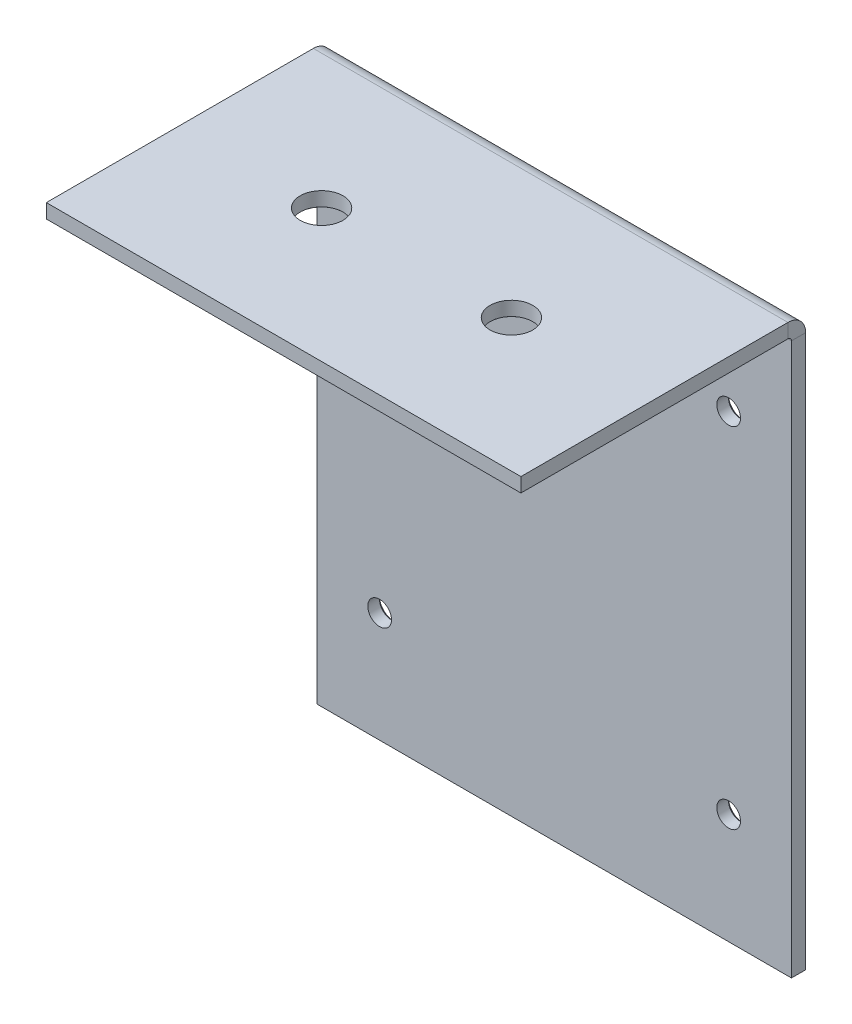
ISO-10303-21;
HEADER;
FILE_DESCRIPTION(('STEP AP214'),'2;1');
FILE_NAME('part.step','',(''),(''),'','','');
FILE_SCHEMA(('AUTOMOTIVE_DESIGN { 1 0 10303 214 1 1 1 1 }'));
ENDSEC;
DATA;
#1=APPLICATION_CONTEXT('core data for automotive mechanical design processes');
#2=APPLICATION_PROTOCOL_DEFINITION('international standard','automotive_design',2000,#1);
#3=PRODUCT_CONTEXT('',#1,'mechanical');
#4=PRODUCT('Part','Part','',(#3));
#5=PRODUCT_RELATED_PRODUCT_CATEGORY('part','',(#4));
#6=PRODUCT_DEFINITION_FORMATION('','',#4);
#7=PRODUCT_DEFINITION_CONTEXT('part definition',#1,'design');
#8=PRODUCT_DEFINITION('design','',#6,#7);
#9=PRODUCT_DEFINITION_SHAPE('','',#8);
#10=(LENGTH_UNIT() NAMED_UNIT(*) SI_UNIT(.MILLI.,.METRE.));
#11=(NAMED_UNIT(*) PLANE_ANGLE_UNIT() SI_UNIT($,.RADIAN.));
#12=(NAMED_UNIT(*) SI_UNIT($,.STERADIAN.) SOLID_ANGLE_UNIT());
#13=UNCERTAINTY_MEASURE_WITH_UNIT(LENGTH_MEASURE(1.E-05),#10,'distance_accuracy_value','');
#14=(GEOMETRIC_REPRESENTATION_CONTEXT(3) GLOBAL_UNCERTAINTY_ASSIGNED_CONTEXT((#13)) GLOBAL_UNIT_ASSIGNED_CONTEXT((#10,
#11,#12)) REPRESENTATION_CONTEXT('',''));
#15=CARTESIAN_POINT('',(0.,0.,0.));
#16=DIRECTION('',(0.,0.,1.));
#17=DIRECTION('',(1.,0.,0.));
#18=AXIS2_PLACEMENT_3D('',#15,#16,#17);
#19=CARTESIAN_POINT('',(0.,0.,-3.));
#20=DIRECTION('',(0.,0.,1.));
#21=DIRECTION('',(1.,0.,0.));
#22=AXIS2_PLACEMENT_3D('',#19,#20,#21);
#23=PLANE('',#22);
#24=CARTESIAN_POINT('',(-36.7699999999996,36.7700000000011,-3.));
#25=DIRECTION('',(0.,0.,-1.));
#26=DIRECTION('',(-1.,0.,0.));
#27=AXIS2_PLACEMENT_3D('',#24,#25,#26);
#28=CIRCLE('',#27,3.025);
#29=CARTESIAN_POINT('',(-39.7949999999996,36.7700000000011,-3.));
#30=VERTEX_POINT('',#29);
#31=EDGE_CURVE('E139',#30,#30,#28,.T.);
#32=ORIENTED_EDGE('',*,*,#31,.F.);
#33=EDGE_LOOP('',(#32));
#34=FACE_BOUND('',#33,.T.);
#35=CARTESIAN_POINT('',(-36.77,-36.7699999999993,-3.));
#36=DIRECTION('',(0.,0.,-1.));
#37=DIRECTION('',(-1.,0.,0.));
#38=AXIS2_PLACEMENT_3D('',#35,#36,#37);
#39=CIRCLE('',#38,3.025);
#40=CARTESIAN_POINT('',(-39.795,-36.7699999999993,-3.));
#41=VERTEX_POINT('',#40);
#42=EDGE_CURVE('E138',#41,#41,#39,.T.);
#43=ORIENTED_EDGE('',*,*,#42,.F.);
#44=EDGE_LOOP('',(#43));
#45=FACE_BOUND('',#44,.T.);
#46=CARTESIAN_POINT('',(36.7699999999999,-36.7699999999994,-3.));
#47=DIRECTION('',(0.,0.,-1.));
#48=DIRECTION('',(-1.,0.,0.));
#49=AXIS2_PLACEMENT_3D('',#46,#47,#48);
#50=CIRCLE('',#49,3.025);
#51=CARTESIAN_POINT('',(33.7449999999999,-36.7699999999994,-3.));
#52=VERTEX_POINT('',#51);
#53=EDGE_CURVE('E131',#52,#52,#50,.T.);
#54=ORIENTED_EDGE('',*,*,#53,.F.);
#55=EDGE_LOOP('',(#54));
#56=FACE_BOUND('',#55,.T.);
#57=DIRECTION('',(-1.,0.,0.));
#58=VECTOR('',#57,1.);
#59=CARTESIAN_POINT('',(-50.,56.2634,-3.));
#60=LINE('',#59,#58);
#61=CARTESIAN_POINT('',(-50.,56.2634,-3.));
#62=VERTEX_POINT('',#61);
#63=CARTESIAN_POINT('',(50.,56.2634,-3.));
#64=VERTEX_POINT('',#63);
#65=EDGE_CURVE('E207',#62,#64,#60,.F.);
#66=ORIENTED_EDGE('',*,*,#65,.T.);
#67=DIRECTION('',(0.,1.,0.));
#68=VECTOR('',#67,1.);
#69=CARTESIAN_POINT('',(50.,60.,-3.));
#70=LINE('',#69,#68);
#71=CARTESIAN_POINT('',(50.,-60.,-3.));
#72=VERTEX_POINT('',#71);
#73=EDGE_CURVE('E116',#72,#64,#70,.T.);
#74=ORIENTED_EDGE('',*,*,#73,.F.);
#75=DIRECTION('',(1.,0.,0.));
#76=VECTOR('',#75,1.);
#77=CARTESIAN_POINT('',(-50.,-60.,-3.));
#78=LINE('',#77,#76);
#79=CARTESIAN_POINT('',(-50.,-60.,-3.));
#80=VERTEX_POINT('',#79);
#81=EDGE_CURVE('E106',#80,#72,#78,.T.);
#82=ORIENTED_EDGE('',*,*,#81,.F.);
#83=DIRECTION('',(0.,-1.,0.));
#84=VECTOR('',#83,1.);
#85=CARTESIAN_POINT('',(-50.,60.,-3.));
#86=LINE('',#85,#84);
#87=EDGE_CURVE('E119',#62,#80,#86,.T.);
#88=ORIENTED_EDGE('',*,*,#87,.F.);
#89=EDGE_LOOP('',(#66,#74,#82,#88));
#90=FACE_BOUND('',#89,.T.);
#91=CARTESIAN_POINT('',(36.77,36.7700000000007,-3.));
#92=DIRECTION('',(0.,0.,-1.));
#93=DIRECTION('',(-1.,0.,0.));
#94=AXIS2_PLACEMENT_3D('',#91,#92,#93);
#95=CIRCLE('',#94,3.025);
#96=CARTESIAN_POINT('',(33.745,36.7700000000007,-3.));
#97=VERTEX_POINT('',#96);
#98=EDGE_CURVE('E145',#97,#97,#95,.T.);
#99=ORIENTED_EDGE('',*,*,#98,.F.);
#100=EDGE_LOOP('',(#99));
#101=FACE_BOUND('',#100,.T.);
#102=ADVANCED_FACE('F65',(#34,#45,#56,#90,#101),#23,.F.);
#103=CARTESIAN_POINT('',(-50.,60.,-3.));
#104=DIRECTION('',(-1.,0.,0.));
#105=DIRECTION('',(0.,-1.,0.));
#106=AXIS2_PLACEMENT_3D('',#103,#104,#105);
#107=PLANE('',#106);
#108=DIRECTION('',(0.,-1.,0.));
#109=VECTOR('',#108,1.);
#110=CARTESIAN_POINT('',(-50.,60.,0.));
#111=LINE('',#110,#109);
#112=CARTESIAN_POINT('',(-50.,56.2634,0.));
#113=VERTEX_POINT('',#112);
#114=CARTESIAN_POINT('',(-50.,-60.,0.));
#115=VERTEX_POINT('',#114);
#116=EDGE_CURVE('E115',#113,#115,#111,.T.);
#117=ORIENTED_EDGE('',*,*,#116,.F.);
#118=DIRECTION('',(0.,0.,-1.));
#119=VECTOR('',#118,1.);
#120=CARTESIAN_POINT('',(-50.,56.2634,0.));
#121=LINE('',#120,#119);
#122=EDGE_CURVE('E216',#113,#62,#121,.T.);
#123=ORIENTED_EDGE('',*,*,#122,.T.);
#124=ORIENTED_EDGE('',*,*,#87,.T.);
#125=DIRECTION('',(0.,0.,1.));
#126=VECTOR('',#125,1.);
#127=CARTESIAN_POINT('',(-50.,-60.,-3.));
#128=LINE('',#127,#126);
#129=EDGE_CURVE('E74',#80,#115,#128,.T.);
#130=ORIENTED_EDGE('',*,*,#129,.T.);
#131=EDGE_LOOP('',(#117,#123,#124,#130));
#132=FACE_BOUND('',#131,.T.);
#133=ADVANCED_FACE('F233',(#132),#107,.T.);
#134=CARTESIAN_POINT('',(0.,0.,0.));
#135=DIRECTION('',(0.,0.,1.));
#136=DIRECTION('',(1.,0.,0.));
#137=AXIS2_PLACEMENT_3D('',#134,#135,#136);
#138=PLANE('',#137);
#139=CARTESIAN_POINT('',(36.77,36.7700000000007,0.));
#140=DIRECTION('',(0.,0.,1.));
#141=DIRECTION('',(1.,0.,0.));
#142=AXIS2_PLACEMENT_3D('',#139,#140,#141);
#143=CIRCLE('',#142,2.49999999999999);
#144=CARTESIAN_POINT('',(39.27,36.7700000000007,0.));
#145=VERTEX_POINT('',#144);
#146=EDGE_CURVE('E136',#145,#145,#143,.T.);
#147=ORIENTED_EDGE('',*,*,#146,.F.);
#148=EDGE_LOOP('',(#147));
#149=FACE_BOUND('',#148,.T.);
#150=CARTESIAN_POINT('',(-36.7699999999996,36.7700000000011,0.));
#151=DIRECTION('',(0.,0.,1.));
#152=DIRECTION('',(1.,0.,0.));
#153=AXIS2_PLACEMENT_3D('',#150,#151,#152);
#154=CIRCLE('',#153,2.49999999999999);
#155=CARTESIAN_POINT('',(-34.2699999999996,36.7700000000011,0.));
#156=VERTEX_POINT('',#155);
#157=EDGE_CURVE('E134',#156,#156,#154,.T.);
#158=ORIENTED_EDGE('',*,*,#157,.F.);
#159=EDGE_LOOP('',(#158));
#160=FACE_BOUND('',#159,.T.);
#161=CARTESIAN_POINT('',(-36.77,-36.7699999999993,0.));
#162=DIRECTION('',(0.,0.,1.));
#163=DIRECTION('',(1.,0.,0.));
#164=AXIS2_PLACEMENT_3D('',#161,#162,#163);
#165=CIRCLE('',#164,2.49999999999999);
#166=CARTESIAN_POINT('',(-34.27,-36.7699999999993,0.));
#167=VERTEX_POINT('',#166);
#168=EDGE_CURVE('E126',#167,#167,#165,.T.);
#169=ORIENTED_EDGE('',*,*,#168,.F.);
#170=EDGE_LOOP('',(#169));
#171=FACE_BOUND('',#170,.T.);
#172=CARTESIAN_POINT('',(36.7699999999999,-36.7699999999994,0.));
#173=DIRECTION('',(0.,0.,1.));
#174=DIRECTION('',(1.,0.,0.));
#175=AXIS2_PLACEMENT_3D('',#172,#173,#174);
#176=CIRCLE('',#175,2.49999999999999);
#177=CARTESIAN_POINT('',(39.2699999999999,-36.7699999999994,0.));
#178=VERTEX_POINT('',#177);
#179=EDGE_CURVE('E121',#178,#178,#176,.T.);
#180=ORIENTED_EDGE('',*,*,#179,.F.);
#181=EDGE_LOOP('',(#180));
#182=FACE_BOUND('',#181,.T.);
#183=DIRECTION('',(0.,1.,0.));
#184=VECTOR('',#183,1.);
#185=CARTESIAN_POINT('',(50.,60.,0.));
#186=LINE('',#185,#184);
#187=CARTESIAN_POINT('',(50.,-60.,0.));
#188=VERTEX_POINT('',#187);
#189=CARTESIAN_POINT('',(50.,56.2634,0.));
#190=VERTEX_POINT('',#189);
#191=EDGE_CURVE('E107',#188,#190,#186,.T.);
#192=ORIENTED_EDGE('',*,*,#191,.T.);
#193=DIRECTION('',(-1.,0.,0.));
#194=VECTOR('',#193,1.);
#195=CARTESIAN_POINT('',(-50.,56.2634,0.));
#196=LINE('',#195,#194);
#197=EDGE_CURVE('E85',#113,#190,#196,.F.);
#198=ORIENTED_EDGE('',*,*,#197,.F.);
#199=ORIENTED_EDGE('',*,*,#116,.T.);
#200=DIRECTION('',(1.,0.,0.));
#201=VECTOR('',#200,1.);
#202=CARTESIAN_POINT('',(-50.,-60.,0.));
#203=LINE('',#202,#201);
#204=EDGE_CURVE('E102',#115,#188,#203,.T.);
#205=ORIENTED_EDGE('',*,*,#204,.T.);
#206=EDGE_LOOP('',(#192,#198,#199,#205));
#207=FACE_BOUND('',#206,.T.);
#208=ADVANCED_FACE('F111',(#149,#160,#171,#182,#207),#138,.T.);
#209=CARTESIAN_POINT('',(50.,60.,-3.));
#210=DIRECTION('',(1.,0.,0.));
#211=DIRECTION('',(0.,1.,0.));
#212=AXIS2_PLACEMENT_3D('',#209,#210,#211);
#213=PLANE('',#212);
#214=DIRECTION('',(0.,0.,-1.));
#215=VECTOR('',#214,1.);
#216=CARTESIAN_POINT('',(50.,56.2634,0.));
#217=LINE('',#216,#215);
#218=EDGE_CURVE('E112',#190,#64,#217,.T.);
#219=ORIENTED_EDGE('',*,*,#218,.F.);
#220=ORIENTED_EDGE('',*,*,#191,.F.);
#221=DIRECTION('',(0.,0.,1.));
#222=VECTOR('',#221,1.);
#223=CARTESIAN_POINT('',(50.,-60.,-3.));
#224=LINE('',#223,#222);
#225=EDGE_CURVE('E13',#72,#188,#224,.T.);
#226=ORIENTED_EDGE('',*,*,#225,.F.);
#227=ORIENTED_EDGE('',*,*,#73,.T.);
#228=EDGE_LOOP('',(#219,#220,#226,#227));
#229=FACE_BOUND('',#228,.T.);
#230=ADVANCED_FACE('F70',(#229),#213,.T.);
#231=CARTESIAN_POINT('',(-50.,-60.,-3.));
#232=DIRECTION('',(0.,-1.,0.));
#233=DIRECTION('',(0.,0.,-1.));
#234=AXIS2_PLACEMENT_3D('',#231,#232,#233);
#235=PLANE('',#234);
#236=ORIENTED_EDGE('',*,*,#204,.F.);
#237=ORIENTED_EDGE('',*,*,#129,.F.);
#238=ORIENTED_EDGE('',*,*,#81,.T.);
#239=ORIENTED_EDGE('',*,*,#225,.T.);
#240=EDGE_LOOP('',(#236,#237,#238,#239));
#241=FACE_BOUND('',#240,.T.);
#242=ADVANCED_FACE('F101',(#241),#235,.T.);
#243=CARTESIAN_POINT('',(50.,56.2634,0.7366));
#244=DIRECTION('',(1.,0.,0.));
#245=DIRECTION('',(0.,0.,-1.));
#246=AXIS2_PLACEMENT_3D('',#243,#244,#245);
#247=PLANE('',#246);
#248=DIRECTION('',(0.,-1.,0.));
#249=VECTOR('',#248,1.);
#250=CARTESIAN_POINT('',(50.,60.,0.736599999999986));
#251=LINE('',#250,#249);
#252=CARTESIAN_POINT('',(50.,57.,0.736599999999997));
#253=VERTEX_POINT('',#252);
#254=CARTESIAN_POINT('',(50.,60.,0.736599999999986));
#255=VERTEX_POINT('',#254);
#256=EDGE_CURVE('E127',#253,#255,#251,.F.);
#257=ORIENTED_EDGE('',*,*,#256,.F.);
#258=CARTESIAN_POINT('',(50.,56.2634,0.7366));
#259=DIRECTION('',(-1.,0.,0.));
#260=DIRECTION('',(0.,0.,1.));
#261=AXIS2_PLACEMENT_3D('',#258,#259,#260);
#262=CIRCLE('',#261,0.736599999999997);
#263=EDGE_CURVE('E218',#190,#253,#262,.F.);
#264=ORIENTED_EDGE('',*,*,#263,.F.);
#265=ORIENTED_EDGE('',*,*,#218,.T.);
#266=CARTESIAN_POINT('',(50.,56.2634,0.7366));
#267=DIRECTION('',(-1.,0.,0.));
#268=DIRECTION('',(0.,0.,1.));
#269=AXIS2_PLACEMENT_3D('',#266,#267,#268);
#270=CIRCLE('',#269,3.7366);
#271=EDGE_CURVE('E215',#64,#255,#270,.F.);
#272=ORIENTED_EDGE('',*,*,#271,.T.);
#273=EDGE_LOOP('',(#257,#264,#265,#272));
#274=FACE_BOUND('',#273,.T.);
#275=ADVANCED_FACE('F241',(#274),#247,.T.);
#276=CARTESIAN_POINT('',(-50.,56.2634,0.7366));
#277=DIRECTION('',(1.,0.,0.));
#278=DIRECTION('',(0.,0.,-1.));
#279=AXIS2_PLACEMENT_3D('',#276,#277,#278);
#280=PLANE('',#279);
#281=CARTESIAN_POINT('',(-50.,56.2634,0.7366));
#282=DIRECTION('',(-1.,0.,0.));
#283=DIRECTION('',(0.,0.,1.));
#284=AXIS2_PLACEMENT_3D('',#281,#282,#283);
#285=CIRCLE('',#284,0.736599999999997);
#286=CARTESIAN_POINT('',(-50.,57.,0.736599999999997));
#287=VERTEX_POINT('',#286);
#288=EDGE_CURVE('E178',#287,#113,#285,.T.);
#289=ORIENTED_EDGE('',*,*,#288,.F.);
#290=DIRECTION('',(0.,-1.,0.));
#291=VECTOR('',#290,1.);
#292=CARTESIAN_POINT('',(-50.,57.,0.736599999999997));
#293=LINE('',#292,#291);
#294=CARTESIAN_POINT('',(-50.,60.,0.736599999999986));
#295=VERTEX_POINT('',#294);
#296=EDGE_CURVE('E203',#287,#295,#293,.F.);
#297=ORIENTED_EDGE('',*,*,#296,.T.);
#298=CARTESIAN_POINT('',(-50.,56.2634,0.7366));
#299=DIRECTION('',(-1.,0.,0.));
#300=DIRECTION('',(0.,0.,1.));
#301=AXIS2_PLACEMENT_3D('',#298,#299,#300);
#302=CIRCLE('',#301,3.7366);
#303=EDGE_CURVE('E213',#295,#62,#302,.T.);
#304=ORIENTED_EDGE('',*,*,#303,.T.);
#305=ORIENTED_EDGE('',*,*,#122,.F.);
#306=EDGE_LOOP('',(#289,#297,#304,#305));
#307=FACE_BOUND('',#306,.T.);
#308=ADVANCED_FACE('F285',(#307),#280,.F.);
#309=CARTESIAN_POINT('',(-50.,56.2634,0.7366));
#310=DIRECTION('',(-1.,0.,0.));
#311=DIRECTION('',(0.,1.,0.));
#312=AXIS2_PLACEMENT_3D('',#309,#310,#311);
#313=CYLINDRICAL_SURFACE('',#312,3.7366);
#314=ORIENTED_EDGE('',*,*,#65,.F.);
#315=ORIENTED_EDGE('',*,*,#303,.F.);
#316=DIRECTION('',(-1.,0.,0.));
#317=VECTOR('',#316,1.);
#318=CARTESIAN_POINT('',(50.,60.,0.736599999999986));
#319=LINE('',#318,#317);
#320=EDGE_CURVE('E196',#295,#255,#319,.F.);
#321=ORIENTED_EDGE('',*,*,#320,.T.);
#322=ORIENTED_EDGE('',*,*,#271,.F.);
#323=EDGE_LOOP('',(#314,#315,#321,#322));
#324=FACE_BOUND('',#323,.T.);
#325=ADVANCED_FACE('F243',(#324),#313,.T.);
#326=CARTESIAN_POINT('',(-50.,56.2634,0.7366));
#327=DIRECTION('',(-1.,0.,0.));
#328=DIRECTION('',(0.,1.,0.));
#329=AXIS2_PLACEMENT_3D('',#326,#327,#328);
#330=CYLINDRICAL_SURFACE('',#329,0.736599999999997);
#331=ORIENTED_EDGE('',*,*,#197,.T.);
#332=ORIENTED_EDGE('',*,*,#263,.T.);
#333=DIRECTION('',(-1.,0.,0.));
#334=VECTOR('',#333,1.);
#335=CARTESIAN_POINT('',(50.,57.,0.736599999999997));
#336=LINE('',#335,#334);
#337=EDGE_CURVE('E204',#253,#287,#336,.T.);
#338=ORIENTED_EDGE('',*,*,#337,.T.);
#339=ORIENTED_EDGE('',*,*,#288,.T.);
#340=EDGE_LOOP('',(#331,#332,#338,#339));
#341=FACE_BOUND('',#340,.T.);
#342=ADVANCED_FACE('F281',(#341),#330,.F.);
#343=CARTESIAN_POINT('',(50.,60.,0.));
#344=DIRECTION('',(-1.,0.,0.));
#345=DIRECTION('',(0.,0.,1.));
#346=AXIS2_PLACEMENT_3D('',#343,#344,#345);
#347=PLANE('',#346);
#348=ORIENTED_EDGE('',*,*,#256,.T.);
#349=DIRECTION('',(0.,0.,-1.));
#350=VECTOR('',#349,1.);
#351=CARTESIAN_POINT('',(50.,60.,-2.22293310556855E-13));
#352=LINE('',#351,#350);
#353=CARTESIAN_POINT('',(50.,60.0000000000002,57.));
#354=VERTEX_POINT('',#353);
#355=EDGE_CURVE('E186',#354,#255,#352,.T.);
#356=ORIENTED_EDGE('',*,*,#355,.F.);
#357=DIRECTION('',(0.,-1.,0.));
#358=VECTOR('',#357,1.);
#359=CARTESIAN_POINT('',(50.,60.0000000000002,57.));
#360=LINE('',#359,#358);
#361=CARTESIAN_POINT('',(50.,57.0000000000002,57.));
#362=VERTEX_POINT('',#361);
#363=EDGE_CURVE('E180',#354,#362,#360,.T.);
#364=ORIENTED_EDGE('',*,*,#363,.T.);
#365=DIRECTION('',(0.,0.,1.));
#366=VECTOR('',#365,1.);
#367=CARTESIAN_POINT('',(50.,57.,0.));
#368=LINE('',#367,#366);
#369=EDGE_CURVE('E194',#362,#253,#368,.F.);
#370=ORIENTED_EDGE('',*,*,#369,.T.);
#371=EDGE_LOOP('',(#348,#356,#364,#370));
#372=FACE_BOUND('',#371,.T.);
#373=ADVANCED_FACE('F346',(#372),#347,.F.);
#374=CARTESIAN_POINT('',(-50.,60.0000000000002,57.));
#375=DIRECTION('',(1.,0.,0.));
#376=DIRECTION('',(0.,0.,-1.));
#377=AXIS2_PLACEMENT_3D('',#374,#375,#376);
#378=PLANE('',#377);
#379=ORIENTED_EDGE('',*,*,#296,.F.);
#380=DIRECTION('',(0.,0.,-1.));
#381=VECTOR('',#380,1.);
#382=CARTESIAN_POINT('',(-50.,57.0000000000002,57.));
#383=LINE('',#382,#381);
#384=CARTESIAN_POINT('',(-50.,57.0000000000002,57.));
#385=VERTEX_POINT('',#384);
#386=EDGE_CURVE('E195',#287,#385,#383,.F.);
#387=ORIENTED_EDGE('',*,*,#386,.T.);
#388=DIRECTION('',(0.,-1.,0.));
#389=VECTOR('',#388,1.);
#390=CARTESIAN_POINT('',(-50.,60.0000000000002,57.));
#391=LINE('',#390,#389);
#392=CARTESIAN_POINT('',(-50.,60.0000000000002,57.));
#393=VERTEX_POINT('',#392);
#394=EDGE_CURVE('E174',#393,#385,#391,.T.);
#395=ORIENTED_EDGE('',*,*,#394,.F.);
#396=DIRECTION('',(0.,0.,1.));
#397=VECTOR('',#396,1.);
#398=CARTESIAN_POINT('',(-50.,60.,-2.22293310556855E-13));
#399=LINE('',#398,#397);
#400=EDGE_CURVE('E181',#295,#393,#399,.T.);
#401=ORIENTED_EDGE('',*,*,#400,.F.);
#402=EDGE_LOOP('',(#379,#387,#395,#401));
#403=FACE_BOUND('',#402,.T.);
#404=ADVANCED_FACE('F257',(#403),#378,.F.);
#405=CARTESIAN_POINT('',(0.,60.,-2.22293310556855E-13));
#406=DIRECTION('',(0.,-1.,0.));
#407=DIRECTION('',(0.,0.,-1.));
#408=AXIS2_PLACEMENT_3D('',#405,#406,#407);
#409=PLANE('',#408);
#410=CARTESIAN_POINT('',(-20.,60.0000000000001,29.));
#411=DIRECTION('',(0.,-1.,0.));
#412=DIRECTION('',(0.,0.,-1.));
#413=AXIS2_PLACEMENT_3D('',#410,#411,#412);
#414=CIRCLE('',#413,4.49999999999999);
#415=CARTESIAN_POINT('',(-20.,60.0000000000001,24.5));
#416=VERTEX_POINT('',#415);
#417=EDGE_CURVE('E67',#416,#416,#414,.T.);
#418=ORIENTED_EDGE('',*,*,#417,.T.);
#419=EDGE_LOOP('',(#418));
#420=FACE_BOUND('',#419,.T.);
#421=CARTESIAN_POINT('',(20.,60.0000000000001,29.));
#422=DIRECTION('',(0.,-1.,0.));
#423=DIRECTION('',(0.,0.,-1.));
#424=AXIS2_PLACEMENT_3D('',#421,#422,#423);
#425=CIRCLE('',#424,4.49999999999999);
#426=CARTESIAN_POINT('',(20.,60.0000000000001,24.5));
#427=VERTEX_POINT('',#426);
#428=EDGE_CURVE('E142',#427,#427,#425,.T.);
#429=ORIENTED_EDGE('',*,*,#428,.T.);
#430=EDGE_LOOP('',(#429));
#431=FACE_BOUND('',#430,.T.);
#432=ORIENTED_EDGE('',*,*,#320,.F.);
#433=ORIENTED_EDGE('',*,*,#400,.T.);
#434=DIRECTION('',(1.,0.,0.));
#435=VECTOR('',#434,1.);
#436=CARTESIAN_POINT('',(0.,60.0000000000002,57.));
#437=LINE('',#436,#435);
#438=EDGE_CURVE('E179',#393,#354,#437,.T.);
#439=ORIENTED_EDGE('',*,*,#438,.T.);
#440=ORIENTED_EDGE('',*,*,#355,.T.);
#441=EDGE_LOOP('',(#432,#433,#439,#440));
#442=FACE_BOUND('',#441,.T.);
#443=ADVANCED_FACE('F252',(#420,#431,#442),#409,.F.);
#444=CARTESIAN_POINT('',(0.,57.,-2.11818866540326E-13));
#445=DIRECTION('',(0.,-1.,0.));
#446=DIRECTION('',(0.,0.,-1.));
#447=AXIS2_PLACEMENT_3D('',#444,#445,#446);
#448=PLANE('',#447);
#449=CARTESIAN_POINT('',(-20.,57.0000000000001,29.));
#450=DIRECTION('',(0.,-1.,0.));
#451=DIRECTION('',(0.,0.,-1.));
#452=AXIS2_PLACEMENT_3D('',#449,#450,#451);
#453=CIRCLE('',#452,4.525);
#454=CARTESIAN_POINT('',(-20.,57.0000000000001,24.475));
#455=VERTEX_POINT('',#454);
#456=EDGE_CURVE('E534',#455,#455,#453,.T.);
#457=ORIENTED_EDGE('',*,*,#456,.F.);
#458=EDGE_LOOP('',(#457));
#459=FACE_BOUND('',#458,.T.);
#460=CARTESIAN_POINT('',(20.,57.0000000000001,29.));
#461=DIRECTION('',(0.,-1.,0.));
#462=DIRECTION('',(0.,0.,-1.));
#463=AXIS2_PLACEMENT_3D('',#460,#461,#462);
#464=CIRCLE('',#463,4.525);
#465=CARTESIAN_POINT('',(20.,57.0000000000001,24.475));
#466=VERTEX_POINT('',#465);
#467=EDGE_CURVE('E151',#466,#466,#464,.T.);
#468=ORIENTED_EDGE('',*,*,#467,.F.);
#469=EDGE_LOOP('',(#468));
#470=FACE_BOUND('',#469,.T.);
#471=ORIENTED_EDGE('',*,*,#386,.F.);
#472=ORIENTED_EDGE('',*,*,#337,.F.);
#473=ORIENTED_EDGE('',*,*,#369,.F.);
#474=DIRECTION('',(-1.,0.,0.));
#475=VECTOR('',#474,1.);
#476=CARTESIAN_POINT('',(50.,57.0000000000002,57.));
#477=LINE('',#476,#475);
#478=EDGE_CURVE('E188',#385,#362,#477,.F.);
#479=ORIENTED_EDGE('',*,*,#478,.F.);
#480=EDGE_LOOP('',(#471,#472,#473,#479));
#481=FACE_BOUND('',#480,.T.);
#482=ADVANCED_FACE('F380',(#459,#470,#481),#448,.T.);
#483=CARTESIAN_POINT('',(50.,60.0000000000002,57.));
#484=DIRECTION('',(0.,0.,-1.));
#485=DIRECTION('',(0.,1.,0.));
#486=AXIS2_PLACEMENT_3D('',#483,#484,#485);
#487=PLANE('',#486);
#488=ORIENTED_EDGE('',*,*,#478,.T.);
#489=ORIENTED_EDGE('',*,*,#363,.F.);
#490=ORIENTED_EDGE('',*,*,#438,.F.);
#491=ORIENTED_EDGE('',*,*,#394,.T.);
#492=EDGE_LOOP('',(#488,#489,#490,#491));
#493=FACE_BOUND('',#492,.T.);
#494=ADVANCED_FACE('F267',(#493),#487,.F.);
#495=CARTESIAN_POINT('',(36.7699999999999,-36.7699999999994,-3.));
#496=DIRECTION('',(0.,0.,-1.));
#497=DIRECTION('',(-1.,0.,0.));
#498=AXIS2_PLACEMENT_3D('',#495,#496,#497);
#499=CYLINDRICAL_SURFACE('',#498,2.49999999999999);
#500=ORIENTED_EDGE('',*,*,#179,.T.);
#501=EDGE_LOOP('',(#500));
#502=FACE_BOUND('',#501,.T.);
#503=CARTESIAN_POINT('',(36.7699999999999,-36.7699999999994,-2.475));
#504=DIRECTION('',(0.,0.,-1.));
#505=DIRECTION('',(-1.,0.,0.));
#506=AXIS2_PLACEMENT_3D('',#503,#504,#505);
#507=CIRCLE('',#506,2.5);
#508=CARTESIAN_POINT('',(34.2699999999999,-36.7699999999994,-2.475));
#509=VERTEX_POINT('',#508);
#510=EDGE_CURVE('E130',#509,#509,#507,.T.);
#511=ORIENTED_EDGE('',*,*,#510,.T.);
#512=EDGE_LOOP('',(#511));
#513=FACE_BOUND('',#512,.T.);
#514=ADVANCED_FACE('F396',(#502,#513),#499,.F.);
#515=CARTESIAN_POINT('',(36.7699999999999,-36.7699999999994,-3.));
#516=DIRECTION('',(0.,0.,-1.));
#517=DIRECTION('',(-1.,0.,0.));
#518=AXIS2_PLACEMENT_3D('',#515,#516,#517);
#519=CONICAL_SURFACE('',#518,3.025,0.785398163397448);
#520=ORIENTED_EDGE('',*,*,#510,.F.);
#521=EDGE_LOOP('',(#520));
#522=FACE_BOUND('',#521,.T.);
#523=ORIENTED_EDGE('',*,*,#53,.T.);
#524=EDGE_LOOP('',(#523));
#525=FACE_BOUND('',#524,.T.);
#526=ADVANCED_FACE('F414',(#522,#525),#519,.F.);
#527=CARTESIAN_POINT('',(-36.77,-36.7699999999993,-3.));
#528=DIRECTION('',(0.,0.,-1.));
#529=DIRECTION('',(-1.,0.,0.));
#530=AXIS2_PLACEMENT_3D('',#527,#528,#529);
#531=CYLINDRICAL_SURFACE('',#530,2.49999999999999);
#532=ORIENTED_EDGE('',*,*,#168,.T.);
#533=EDGE_LOOP('',(#532));
#534=FACE_BOUND('',#533,.T.);
#535=CARTESIAN_POINT('',(-36.77,-36.7699999999993,-2.475));
#536=DIRECTION('',(0.,0.,-1.));
#537=DIRECTION('',(-1.,0.,0.));
#538=AXIS2_PLACEMENT_3D('',#535,#536,#537);
#539=CIRCLE('',#538,2.5);
#540=CARTESIAN_POINT('',(-39.27,-36.7699999999993,-2.475));
#541=VERTEX_POINT('',#540);
#542=EDGE_CURVE('E132',#541,#541,#539,.T.);
#543=ORIENTED_EDGE('',*,*,#542,.T.);
#544=EDGE_LOOP('',(#543));
#545=FACE_BOUND('',#544,.T.);
#546=ADVANCED_FACE('F422',(#534,#545),#531,.F.);
#547=CARTESIAN_POINT('',(-36.77,-36.7699999999993,-3.));
#548=DIRECTION('',(0.,0.,-1.));
#549=DIRECTION('',(-1.,0.,0.));
#550=AXIS2_PLACEMENT_3D('',#547,#548,#549);
#551=CONICAL_SURFACE('',#550,3.025,0.785398163397448);
#552=ORIENTED_EDGE('',*,*,#542,.F.);
#553=EDGE_LOOP('',(#552));
#554=FACE_BOUND('',#553,.T.);
#555=ORIENTED_EDGE('',*,*,#42,.T.);
#556=EDGE_LOOP('',(#555));
#557=FACE_BOUND('',#556,.T.);
#558=ADVANCED_FACE('F436',(#554,#557),#551,.F.);
#559=CARTESIAN_POINT('',(-36.7699999999996,36.7700000000011,-3.));
#560=DIRECTION('',(0.,0.,-1.));
#561=DIRECTION('',(-1.,0.,0.));
#562=AXIS2_PLACEMENT_3D('',#559,#560,#561);
#563=CYLINDRICAL_SURFACE('',#562,2.49999999999999);
#564=ORIENTED_EDGE('',*,*,#157,.T.);
#565=EDGE_LOOP('',(#564));
#566=FACE_BOUND('',#565,.T.);
#567=CARTESIAN_POINT('',(-36.7699999999996,36.7700000000011,-2.475));
#568=DIRECTION('',(0.,0.,-1.));
#569=DIRECTION('',(-1.,0.,0.));
#570=AXIS2_PLACEMENT_3D('',#567,#568,#569);
#571=CIRCLE('',#570,2.5);
#572=CARTESIAN_POINT('',(-39.2699999999996,36.7700000000011,-2.475));
#573=VERTEX_POINT('',#572);
#574=EDGE_CURVE('E140',#573,#573,#571,.T.);
#575=ORIENTED_EDGE('',*,*,#574,.T.);
#576=EDGE_LOOP('',(#575));
#577=FACE_BOUND('',#576,.T.);
#578=ADVANCED_FACE('F446',(#566,#577),#563,.F.);
#579=CARTESIAN_POINT('',(-36.7699999999996,36.7700000000011,-3.));
#580=DIRECTION('',(0.,0.,-1.));
#581=DIRECTION('',(-1.,0.,0.));
#582=AXIS2_PLACEMENT_3D('',#579,#580,#581);
#583=CONICAL_SURFACE('',#582,3.025,0.785398163397448);
#584=ORIENTED_EDGE('',*,*,#574,.F.);
#585=EDGE_LOOP('',(#584));
#586=FACE_BOUND('',#585,.T.);
#587=ORIENTED_EDGE('',*,*,#31,.T.);
#588=EDGE_LOOP('',(#587));
#589=FACE_BOUND('',#588,.T.);
#590=ADVANCED_FACE('F460',(#586,#589),#583,.F.);
#591=CARTESIAN_POINT('',(36.77,36.7700000000007,-3.));
#592=DIRECTION('',(0.,0.,-1.));
#593=DIRECTION('',(-1.,0.,0.));
#594=AXIS2_PLACEMENT_3D('',#591,#592,#593);
#595=CYLINDRICAL_SURFACE('',#594,2.49999999999999);
#596=ORIENTED_EDGE('',*,*,#146,.T.);
#597=EDGE_LOOP('',(#596));
#598=FACE_BOUND('',#597,.T.);
#599=CARTESIAN_POINT('',(36.77,36.7700000000007,-2.475));
#600=DIRECTION('',(0.,0.,-1.));
#601=DIRECTION('',(-1.,0.,0.));
#602=AXIS2_PLACEMENT_3D('',#599,#600,#601);
#603=CIRCLE('',#602,2.5);
#604=CARTESIAN_POINT('',(34.2700000000001,36.7700000000007,-2.475));
#605=VERTEX_POINT('',#604);
#606=EDGE_CURVE('E143',#605,#605,#603,.T.);
#607=ORIENTED_EDGE('',*,*,#606,.T.);
#608=EDGE_LOOP('',(#607));
#609=FACE_BOUND('',#608,.T.);
#610=ADVANCED_FACE('F470',(#598,#609),#595,.F.);
#611=CARTESIAN_POINT('',(36.77,36.7700000000007,-3.));
#612=DIRECTION('',(0.,0.,-1.));
#613=DIRECTION('',(-1.,0.,0.));
#614=AXIS2_PLACEMENT_3D('',#611,#612,#613);
#615=CONICAL_SURFACE('',#614,3.025,0.785398163397448);
#616=ORIENTED_EDGE('',*,*,#606,.F.);
#617=EDGE_LOOP('',(#616));
#618=FACE_BOUND('',#617,.T.);
#619=ORIENTED_EDGE('',*,*,#98,.T.);
#620=EDGE_LOOP('',(#619));
#621=FACE_BOUND('',#620,.T.);
#622=ADVANCED_FACE('F476',(#618,#621),#615,.F.);
#623=CARTESIAN_POINT('',(20.,57.0000000000001,29.));
#624=DIRECTION('',(0.,-1.,0.));
#625=DIRECTION('',(0.,0.,-1.));
#626=AXIS2_PLACEMENT_3D('',#623,#624,#625);
#627=CYLINDRICAL_SURFACE('',#626,4.49999999999999);
#628=CARTESIAN_POINT('',(20.,57.0250000000001,29.));
#629=DIRECTION('',(0.,-1.,0.));
#630=DIRECTION('',(0.,0.,-1.));
#631=AXIS2_PLACEMENT_3D('',#628,#629,#630);
#632=CIRCLE('',#631,4.5);
#633=CARTESIAN_POINT('',(20.,57.0250000000001,24.5));
#634=VERTEX_POINT('',#633);
#635=EDGE_CURVE('E144',#634,#634,#632,.T.);
#636=ORIENTED_EDGE('',*,*,#635,.T.);
#637=EDGE_LOOP('',(#636));
#638=FACE_BOUND('',#637,.T.);
#639=ORIENTED_EDGE('',*,*,#428,.F.);
#640=EDGE_LOOP('',(#639));
#641=FACE_BOUND('',#640,.T.);
#642=ADVANCED_FACE('F490',(#638,#641),#627,.F.);
#643=CARTESIAN_POINT('',(20.,57.0000000000001,29.));
#644=DIRECTION('',(0.,-1.,0.));
#645=DIRECTION('',(0.,0.,-1.));
#646=AXIS2_PLACEMENT_3D('',#643,#644,#645);
#647=CONICAL_SURFACE('',#646,4.525,0.785398163397587);
#648=ORIENTED_EDGE('',*,*,#635,.F.);
#649=EDGE_LOOP('',(#648));
#650=FACE_BOUND('',#649,.T.);
#651=ORIENTED_EDGE('',*,*,#467,.T.);
#652=EDGE_LOOP('',(#651));
#653=FACE_BOUND('',#652,.T.);
#654=ADVANCED_FACE('F497',(#650,#653),#647,.F.);
#655=CARTESIAN_POINT('',(-20.,57.0000000000001,29.));
#656=DIRECTION('',(0.,-1.,0.));
#657=DIRECTION('',(0.,0.,-1.));
#658=AXIS2_PLACEMENT_3D('',#655,#656,#657);
#659=CYLINDRICAL_SURFACE('',#658,4.49999999999999);
#660=CARTESIAN_POINT('',(-20.,57.0250000000001,29.));
#661=DIRECTION('',(0.,-1.,0.));
#662=DIRECTION('',(0.,0.,-1.));
#663=AXIS2_PLACEMENT_3D('',#660,#661,#662);
#664=CIRCLE('',#663,4.5);
#665=CARTESIAN_POINT('',(-20.,57.0250000000001,24.5));
#666=VERTEX_POINT('',#665);
#667=EDGE_CURVE('E533',#666,#666,#664,.T.);
#668=ORIENTED_EDGE('',*,*,#667,.T.);
#669=EDGE_LOOP('',(#668));
#670=FACE_BOUND('',#669,.T.);
#671=ORIENTED_EDGE('',*,*,#417,.F.);
#672=EDGE_LOOP('',(#671));
#673=FACE_BOUND('',#672,.T.);
#674=ADVANCED_FACE('F505',(#670,#673),#659,.F.);
#675=CARTESIAN_POINT('',(-20.,57.0000000000001,29.));
#676=DIRECTION('',(0.,-1.,0.));
#677=DIRECTION('',(0.,0.,-1.));
#678=AXIS2_PLACEMENT_3D('',#675,#676,#677);
#679=CONICAL_SURFACE('',#678,4.525,0.785398163397552);
#680=ORIENTED_EDGE('',*,*,#667,.F.);
#681=EDGE_LOOP('',(#680));
#682=FACE_BOUND('',#681,.T.);
#683=ORIENTED_EDGE('',*,*,#456,.T.);
#684=EDGE_LOOP('',(#683));
#685=FACE_BOUND('',#684,.T.);
#686=ADVANCED_FACE('F513',(#682,#685),#679,.F.);
#687=CLOSED_SHELL('',(#102,#133,#208,#230,#242,#275,#308,#325,#342,#373,#404,#443,#482,#494,
#514,#526,#546,#558,#578,#590,#610,#622,#642,#654,#674,#686));
#688=MANIFOLD_SOLID_BREP('B2',#687);
#689=ADVANCED_BREP_SHAPE_REPRESENTATION('',(#18,#688),#14);
#690=SHAPE_DEFINITION_REPRESENTATION(#9,#689);
ENDSEC;
END-ISO-10303-21;
